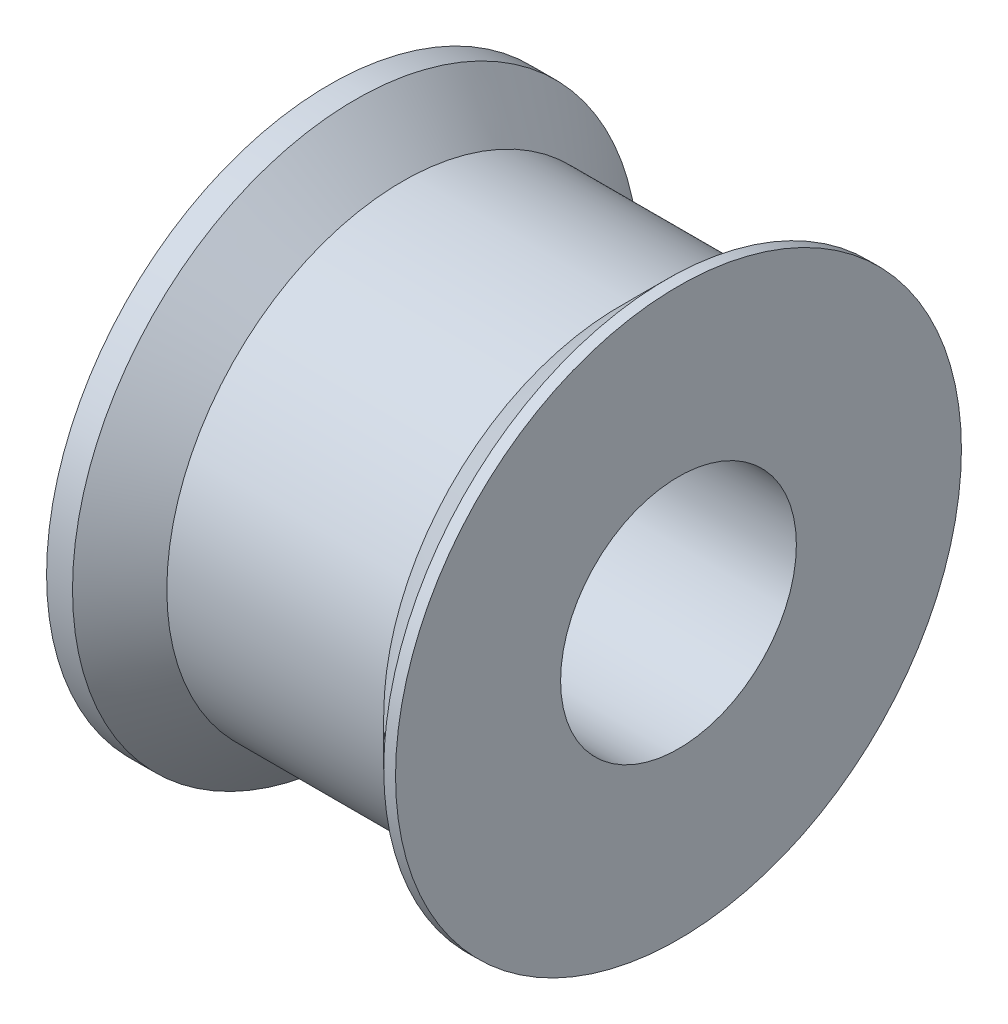
ISO-10303-21;
HEADER;
FILE_DESCRIPTION(('STEP AP214'),'2;1');
FILE_NAME('part.step','',(''),(''),'','','');
FILE_SCHEMA(('AUTOMOTIVE_DESIGN { 1 0 10303 214 1 1 1 1 }'));
ENDSEC;
DATA;
#1=APPLICATION_CONTEXT('core data for automotive mechanical design processes');
#2=APPLICATION_PROTOCOL_DEFINITION('international standard','automotive_design',2000,#1);
#3=PRODUCT_CONTEXT('',#1,'mechanical');
#4=PRODUCT('Part','Part','',(#3));
#5=PRODUCT_RELATED_PRODUCT_CATEGORY('part','',(#4));
#6=PRODUCT_DEFINITION_FORMATION('','',#4);
#7=PRODUCT_DEFINITION_CONTEXT('part definition',#1,'design');
#8=PRODUCT_DEFINITION('design','',#6,#7);
#9=PRODUCT_DEFINITION_SHAPE('','',#8);
#10=(LENGTH_UNIT() NAMED_UNIT(*) SI_UNIT(.MILLI.,.METRE.));
#11=(NAMED_UNIT(*) PLANE_ANGLE_UNIT() SI_UNIT($,.RADIAN.));
#12=(NAMED_UNIT(*) SI_UNIT($,.STERADIAN.) SOLID_ANGLE_UNIT());
#13=UNCERTAINTY_MEASURE_WITH_UNIT(LENGTH_MEASURE(1.E-05),#10,'distance_accuracy_value','');
#14=(GEOMETRIC_REPRESENTATION_CONTEXT(3) GLOBAL_UNCERTAINTY_ASSIGNED_CONTEXT((#13)) GLOBAL_UNIT_ASSIGNED_CONTEXT((#10,
#11,#12)) REPRESENTATION_CONTEXT('',''));
#15=CARTESIAN_POINT('',(0.,0.,0.));
#16=DIRECTION('',(0.,0.,1.));
#17=DIRECTION('',(1.,0.,0.));
#18=AXIS2_PLACEMENT_3D('',#15,#16,#17);
#19=CARTESIAN_POINT('',(-7.7,0.,0.));
#20=DIRECTION('',(-1.,0.,0.));
#21=DIRECTION('',(0.,0.,1.));
#22=AXIS2_PLACEMENT_3D('',#19,#20,#21);
#23=PLANE('',#22);
#24=CARTESIAN_POINT('',(-7.7,0.,0.));
#25=DIRECTION('',(-1.,0.,0.));
#26=DIRECTION('',(0.,0.,1.));
#27=AXIS2_PLACEMENT_3D('',#24,#25,#26);
#28=CIRCLE('',#27,2.);
#29=CARTESIAN_POINT('',(-7.7,0.,2.));
#30=VERTEX_POINT('',#29);
#31=EDGE_CURVE('E56',#30,#30,#28,.T.);
#32=ORIENTED_EDGE('',*,*,#31,.F.);
#33=EDGE_LOOP('',(#32));
#34=FACE_BOUND('',#33,.T.);
#35=CARTESIAN_POINT('',(-7.7,0.,0.));
#36=DIRECTION('',(1.,0.,0.));
#37=DIRECTION('',(0.,0.,-1.));
#38=AXIS2_PLACEMENT_3D('',#35,#36,#37);
#39=CIRCLE('',#38,12.);
#40=CARTESIAN_POINT('',(-7.7,0.,-12.));
#41=VERTEX_POINT('',#40);
#42=EDGE_CURVE('E10',#41,#41,#39,.T.);
#43=ORIENTED_EDGE('',*,*,#42,.F.);
#44=EDGE_LOOP('',(#43));
#45=FACE_BOUND('',#44,.T.);
#46=ADVANCED_FACE('F31',(#34,#45),#23,.T.);
#47=CARTESIAN_POINT('',(7.1,0.,0.));
#48=DIRECTION('',(1.,0.,0.));
#49=DIRECTION('',(0.,0.,-1.));
#50=AXIS2_PLACEMENT_3D('',#47,#48,#49);
#51=CYLINDRICAL_SURFACE('',#50,12.);
#52=CARTESIAN_POINT('',(-6.60000000000001,0.,0.));
#53=DIRECTION('',(1.,0.,0.));
#54=DIRECTION('',(0.,0.,-1.));
#55=AXIS2_PLACEMENT_3D('',#52,#53,#54);
#56=CIRCLE('',#55,12.);
#57=CARTESIAN_POINT('',(-6.60000000000001,0.,-12.));
#58=VERTEX_POINT('',#57);
#59=EDGE_CURVE('E38',#58,#58,#56,.T.);
#60=ORIENTED_EDGE('',*,*,#59,.F.);
#61=EDGE_LOOP('',(#60));
#62=FACE_BOUND('',#61,.T.);
#63=ORIENTED_EDGE('',*,*,#42,.T.);
#64=EDGE_LOOP('',(#63));
#65=FACE_BOUND('',#64,.T.);
#66=ADVANCED_FACE('F84',(#62,#65),#51,.T.);
#67=CARTESIAN_POINT('',(-6.60000000000001,0.,0.));
#68=DIRECTION('',(-1.,0.,0.));
#69=DIRECTION('',(0.,0.,1.));
#70=AXIS2_PLACEMENT_3D('',#67,#68,#69);
#71=CONICAL_SURFACE('',#70,12.,0.785398163397445);
#72=CARTESIAN_POINT('',(-4.6,0.,0.));
#73=DIRECTION('',(1.,0.,0.));
#74=DIRECTION('',(0.,0.,-1.));
#75=AXIS2_PLACEMENT_3D('',#72,#73,#74);
#76=CIRCLE('',#75,9.99999999999999);
#77=CARTESIAN_POINT('',(-4.6,0.,-9.99999999999999));
#78=VERTEX_POINT('',#77);
#79=EDGE_CURVE('E42',#78,#78,#76,.T.);
#80=ORIENTED_EDGE('',*,*,#79,.F.);
#81=EDGE_LOOP('',(#80));
#82=FACE_BOUND('',#81,.T.);
#83=ORIENTED_EDGE('',*,*,#59,.T.);
#84=EDGE_LOOP('',(#83));
#85=FACE_BOUND('',#84,.T.);
#86=ADVANCED_FACE('F88',(#82,#85),#71,.T.);
#87=CARTESIAN_POINT('',(7.1,0.,0.));
#88=DIRECTION('',(1.,0.,0.));
#89=DIRECTION('',(0.,0.,-1.));
#90=AXIS2_PLACEMENT_3D('',#87,#88,#89);
#91=CYLINDRICAL_SURFACE('',#90,9.99999999999997);
#92=CARTESIAN_POINT('',(4.6,0.,0.));
#93=DIRECTION('',(1.,0.,0.));
#94=DIRECTION('',(0.,0.,-1.));
#95=AXIS2_PLACEMENT_3D('',#92,#93,#94);
#96=CIRCLE('',#95,9.99999999999994);
#97=CARTESIAN_POINT('',(4.6,0.,-9.99999999999994));
#98=VERTEX_POINT('',#97);
#99=EDGE_CURVE('E47',#98,#98,#96,.T.);
#100=ORIENTED_EDGE('',*,*,#99,.F.);
#101=EDGE_LOOP('',(#100));
#102=FACE_BOUND('',#101,.T.);
#103=ORIENTED_EDGE('',*,*,#79,.T.);
#104=EDGE_LOOP('',(#103));
#105=FACE_BOUND('',#104,.T.);
#106=ADVANCED_FACE('F93',(#102,#105),#91,.T.);
#107=CARTESIAN_POINT('',(4.6,0.,0.));
#108=DIRECTION('',(1.,0.,0.));
#109=DIRECTION('',(0.,0.,-1.));
#110=AXIS2_PLACEMENT_3D('',#107,#108,#109);
#111=CONICAL_SURFACE('',#110,9.99999999999994,0.785398163397458);
#112=CARTESIAN_POINT('',(6.60000000000001,0.,0.));
#113=DIRECTION('',(1.,0.,0.));
#114=DIRECTION('',(0.,0.,-1.));
#115=AXIS2_PLACEMENT_3D('',#112,#113,#114);
#116=CIRCLE('',#115,12.);
#117=CARTESIAN_POINT('',(6.60000000000001,0.,-12.));
#118=VERTEX_POINT('',#117);
#119=EDGE_CURVE('E50',#118,#118,#116,.T.);
#120=ORIENTED_EDGE('',*,*,#119,.F.);
#121=EDGE_LOOP('',(#120));
#122=FACE_BOUND('',#121,.T.);
#123=ORIENTED_EDGE('',*,*,#99,.T.);
#124=EDGE_LOOP('',(#123));
#125=FACE_BOUND('',#124,.T.);
#126=ADVANCED_FACE('F100',(#122,#125),#111,.T.);
#127=CARTESIAN_POINT('',(7.1,0.,0.));
#128=DIRECTION('',(1.,0.,0.));
#129=DIRECTION('',(0.,0.,-1.));
#130=AXIS2_PLACEMENT_3D('',#127,#128,#129);
#131=CYLINDRICAL_SURFACE('',#130,12.);
#132=CARTESIAN_POINT('',(7.10000000000001,0.,0.));
#133=DIRECTION('',(1.,0.,0.));
#134=DIRECTION('',(0.,0.,-1.));
#135=AXIS2_PLACEMENT_3D('',#132,#133,#134);
#136=CIRCLE('',#135,12.);
#137=CARTESIAN_POINT('',(7.10000000000001,0.,-12.));
#138=VERTEX_POINT('',#137);
#139=EDGE_CURVE('E53',#138,#138,#136,.T.);
#140=ORIENTED_EDGE('',*,*,#139,.F.);
#141=EDGE_LOOP('',(#140));
#142=FACE_BOUND('',#141,.T.);
#143=ORIENTED_EDGE('',*,*,#119,.T.);
#144=EDGE_LOOP('',(#143));
#145=FACE_BOUND('',#144,.T.);
#146=ADVANCED_FACE('F104',(#142,#145),#131,.T.);
#147=CARTESIAN_POINT('',(7.1,0.,0.));
#148=DIRECTION('',(-1.,0.,0.));
#149=DIRECTION('',(0.,0.,1.));
#150=AXIS2_PLACEMENT_3D('',#147,#148,#149);
#151=PLANE('',#150);
#152=CARTESIAN_POINT('',(7.1,0.,0.));
#153=DIRECTION('',(-1.,0.,0.));
#154=DIRECTION('',(0.,0.,1.));
#155=AXIS2_PLACEMENT_3D('',#152,#153,#154);
#156=CIRCLE('',#155,5.00000000000065);
#157=CARTESIAN_POINT('',(7.1,0.,5.00000000000056));
#158=VERTEX_POINT('',#157);
#159=EDGE_CURVE('E59',#158,#158,#156,.F.);
#160=ORIENTED_EDGE('',*,*,#159,.F.);
#161=EDGE_LOOP('',(#160));
#162=FACE_BOUND('',#161,.T.);
#163=ORIENTED_EDGE('',*,*,#139,.T.);
#164=EDGE_LOOP('',(#163));
#165=FACE_BOUND('',#164,.T.);
#166=ADVANCED_FACE('F78',(#162,#165),#151,.F.);
#167=CARTESIAN_POINT('',(12.7568542494924,0.,0.));
#168=DIRECTION('',(-1.,0.,0.));
#169=DIRECTION('',(0.,0.,1.));
#170=AXIS2_PLACEMENT_3D('',#167,#168,#169);
#171=CYLINDRICAL_SURFACE('',#170,2.);
#172=CARTESIAN_POINT('',(-5.7,0.,0.));
#173=DIRECTION('',(-1.,0.,0.));
#174=DIRECTION('',(0.,0.,1.));
#175=AXIS2_PLACEMENT_3D('',#172,#173,#174);
#176=CIRCLE('',#175,2.);
#177=CARTESIAN_POINT('',(-5.7,0.,2.));
#178=VERTEX_POINT('',#177);
#179=EDGE_CURVE('E34',#178,#178,#176,.F.);
#180=CARTESIAN_POINT('',(-5.7,0.,2.));
#181=CARTESIAN_POINT('',(-5.72083333333333,0.,2.));
#182=CARTESIAN_POINT('',(-5.74166666666667,0.,2.));
#183=CARTESIAN_POINT('',(-5.78333333333333,0.,2.));
#184=CARTESIAN_POINT('',(-5.80416666666667,0.,2.));
#185=CARTESIAN_POINT('',(-5.84583333333333,0.,2.));
#186=CARTESIAN_POINT('',(-5.86666666666667,0.,2.));
#187=CARTESIAN_POINT('',(-5.90833333333333,0.,2.));
#188=CARTESIAN_POINT('',(-5.92916666666667,0.,2.));
#189=CARTESIAN_POINT('',(-5.97083333333333,0.,2.));
#190=CARTESIAN_POINT('',(-5.99166666666667,0.,2.));
#191=CARTESIAN_POINT('',(-6.03333333333333,0.,2.));
#192=CARTESIAN_POINT('',(-6.05416666666667,0.,2.));
#193=CARTESIAN_POINT('',(-6.09583333333333,0.,2.));
#194=CARTESIAN_POINT('',(-6.11666666666667,0.,2.));
#195=CARTESIAN_POINT('',(-6.15833333333333,0.,2.));
#196=CARTESIAN_POINT('',(-6.17916666666667,0.,2.));
#197=CARTESIAN_POINT('',(-6.22083333333333,0.,2.));
#198=CARTESIAN_POINT('',(-6.24166666666667,0.,2.));
#199=CARTESIAN_POINT('',(-6.28333333333333,0.,2.));
#200=CARTESIAN_POINT('',(-6.30416666666667,0.,2.));
#201=CARTESIAN_POINT('',(-6.34583333333333,0.,2.));
#202=CARTESIAN_POINT('',(-6.36666666666667,0.,2.));
#203=CARTESIAN_POINT('',(-6.40833333333333,0.,2.));
#204=CARTESIAN_POINT('',(-6.42916666666667,0.,2.));
#205=CARTESIAN_POINT('',(-6.47083333333333,0.,2.));
#206=CARTESIAN_POINT('',(-6.49166666666667,0.,2.));
#207=CARTESIAN_POINT('',(-6.53333333333333,0.,2.));
#208=CARTESIAN_POINT('',(-6.55416666666667,0.,2.));
#209=CARTESIAN_POINT('',(-6.59583333333333,0.,2.));
#210=CARTESIAN_POINT('',(-6.61666666666667,0.,2.));
#211=CARTESIAN_POINT('',(-6.65833333333333,0.,2.));
#212=CARTESIAN_POINT('',(-6.67916666666667,0.,2.));
#213=CARTESIAN_POINT('',(-6.72083333333333,0.,2.));
#214=CARTESIAN_POINT('',(-6.74166666666667,0.,2.));
#215=CARTESIAN_POINT('',(-6.78333333333333,0.,2.));
#216=CARTESIAN_POINT('',(-6.80416666666667,0.,2.));
#217=CARTESIAN_POINT('',(-6.84583333333333,0.,2.));
#218=CARTESIAN_POINT('',(-6.86666666666667,0.,2.));
#219=CARTESIAN_POINT('',(-6.90833333333333,0.,2.));
#220=CARTESIAN_POINT('',(-6.92916666666667,0.,2.));
#221=CARTESIAN_POINT('',(-6.97083333333333,0.,2.));
#222=CARTESIAN_POINT('',(-6.99166666666667,0.,2.));
#223=CARTESIAN_POINT('',(-7.03333333333333,0.,2.));
#224=CARTESIAN_POINT('',(-7.05416666666667,0.,2.));
#225=CARTESIAN_POINT('',(-7.09583333333333,0.,2.));
#226=CARTESIAN_POINT('',(-7.11666666666667,0.,2.));
#227=CARTESIAN_POINT('',(-7.15833333333333,0.,2.));
#228=CARTESIAN_POINT('',(-7.17916666666667,0.,2.));
#229=CARTESIAN_POINT('',(-7.22083333333333,0.,2.));
#230=CARTESIAN_POINT('',(-7.24166666666667,0.,2.));
#231=CARTESIAN_POINT('',(-7.28333333333333,0.,2.));
#232=CARTESIAN_POINT('',(-7.30416666666667,0.,2.));
#233=CARTESIAN_POINT('',(-7.34583333333333,0.,2.));
#234=CARTESIAN_POINT('',(-7.36666666666667,0.,2.));
#235=CARTESIAN_POINT('',(-7.40833333333333,0.,2.));
#236=CARTESIAN_POINT('',(-7.42916666666667,0.,2.));
#237=CARTESIAN_POINT('',(-7.47083333333333,0.,2.));
#238=CARTESIAN_POINT('',(-7.49166666666667,0.,2.));
#239=CARTESIAN_POINT('',(-7.53333333333334,0.,2.));
#240=CARTESIAN_POINT('',(-7.55416666666667,0.,2.));
#241=CARTESIAN_POINT('',(-7.59583333333334,0.,2.));
#242=CARTESIAN_POINT('',(-7.61666666666667,0.,2.));
#243=CARTESIAN_POINT('',(-7.65833333333334,0.,2.));
#244=CARTESIAN_POINT('',(-7.67916666666667,0.,2.));
#245=CARTESIAN_POINT('',(-7.7,0.,2.));
#246=B_SPLINE_CURVE_WITH_KNOTS('',3,(#180,#181,#182,#183,#184,#185,#186,#187,#188,#189,#190,
#191,#192,#193,#194,#195,#196,#197,#198,#199,#200,#201,#202,#203,#204,#205,#206,#207,#208,#209,
#210,#211,#212,#213,#214,#215,#216,#217,#218,#219,#220,#221,#222,#223,#224,#225,#226,#227,#228,
#229,#230,#231,#232,#233,#234,#235,#236,#237,#238,#239,#240,#241,#242,#243,#244,#245),
.UNSPECIFIED.,.F.,.F.,(4,2,2,2,2,2,2,2,2,2,2,2,2,2,2,2,2,2,2,2,2,2,2,2,2,2,2,2,2,2,2,2,4),(0.,
0.0625000000000001,0.125,0.1875,0.25,0.3125,0.375,0.4375,0.5,0.5625,0.625000000000001,
0.687500000000001,0.750000000000001,0.812500000000001,0.875000000000001,0.937500000000001,1.,
1.0625,1.125,1.1875,1.25,1.3125,1.375,1.4375,1.5,1.5625,1.625,1.6875,1.75,1.8125,1.875,1.9375,
2.),.UNSPECIFIED.);
#247=EDGE_CURVE('BSEAM71',#178,#30,#246,.T.);
#248=ORIENTED_EDGE('',*,*,#179,.T.);
#249=ORIENTED_EDGE('',*,*,#31,.T.);
#250=ORIENTED_EDGE('',*,*,#247,.T.);
#251=ORIENTED_EDGE('',*,*,#247,.F.);
#252=EDGE_LOOP('',(#248,#250,#249,#251));
#253=FACE_BOUND('',#252,.T.);
#254=ADVANCED_FACE('F71',(#253),#171,.F.);
#255=CARTESIAN_POINT('',(-5.7,0.,0.));
#256=DIRECTION('',(-1.,0.,0.));
#257=DIRECTION('',(0.,0.,1.));
#258=AXIS2_PLACEMENT_3D('',#255,#256,#257);
#259=PLANE('',#258);
#260=CARTESIAN_POINT('',(-5.7,0.,0.));
#261=DIRECTION('',(-1.,0.,0.));
#262=DIRECTION('',(0.,0.,1.));
#263=AXIS2_PLACEMENT_3D('',#260,#261,#262);
#264=CIRCLE('',#263,5.00000000000065);
#265=CARTESIAN_POINT('',(-5.7,0.,5.00000000000056));
#266=VERTEX_POINT('',#265);
#267=EDGE_CURVE('E62',#266,#266,#264,.T.);
#268=ORIENTED_EDGE('',*,*,#267,.F.);
#269=EDGE_LOOP('',(#268));
#270=FACE_BOUND('',#269,.T.);
#271=ORIENTED_EDGE('',*,*,#179,.F.);
#272=EDGE_LOOP('',(#271));
#273=FACE_BOUND('',#272,.T.);
#274=ADVANCED_FACE('F68',(#270,#273),#259,.F.);
#275=CARTESIAN_POINT('',(21.2421356237328,0.,0.));
#276=DIRECTION('',(-1.,0.,0.));
#277=DIRECTION('',(0.,0.,1.));
#278=AXIS2_PLACEMENT_3D('',#275,#276,#277);
#279=CYLINDRICAL_SURFACE('',#278,5.00000000000065);
#280=ORIENTED_EDGE('',*,*,#159,.T.);
#281=EDGE_LOOP('',(#280));
#282=FACE_BOUND('',#281,.T.);
#283=ORIENTED_EDGE('',*,*,#267,.T.);
#284=EDGE_LOOP('',(#283));
#285=FACE_BOUND('',#284,.T.);
#286=ADVANCED_FACE('F66',(#282,#285),#279,.F.);
#287=CLOSED_SHELL('',(#46,#66,#86,#106,#126,#146,#166,#254,#274,#286));
#288=MANIFOLD_SOLID_BREP('B2',#287);
#289=ADVANCED_BREP_SHAPE_REPRESENTATION('',(#18,#288),#14);
#290=SHAPE_DEFINITION_REPRESENTATION(#9,#289);
ENDSEC;
END-ISO-10303-21;
